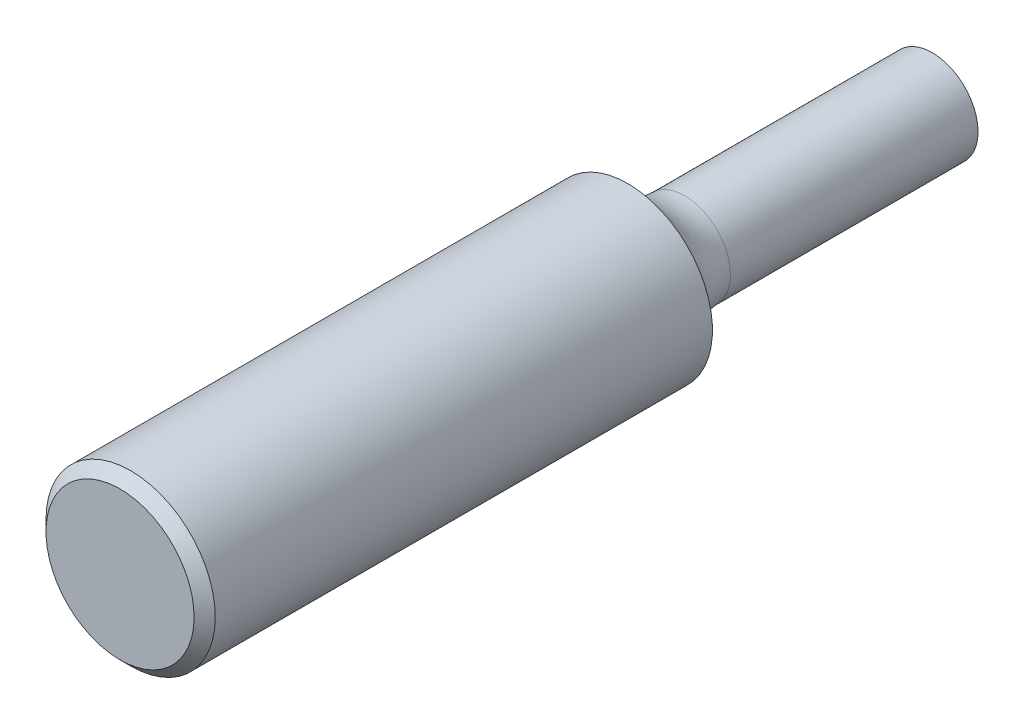
ISO-10303-21;
HEADER;
FILE_DESCRIPTION(('STEP AP214'),'2;1');
FILE_NAME('part.step','',(''),(''),'','','');
FILE_SCHEMA(('AUTOMOTIVE_DESIGN { 1 0 10303 214 1 1 1 1 }'));
ENDSEC;
DATA;
#1=APPLICATION_CONTEXT('core data for automotive mechanical design processes');
#2=APPLICATION_PROTOCOL_DEFINITION('international standard','automotive_design',2000,#1);
#3=PRODUCT_CONTEXT('',#1,'mechanical');
#4=PRODUCT('Part','Part','',(#3));
#5=PRODUCT_RELATED_PRODUCT_CATEGORY('part','',(#4));
#6=PRODUCT_DEFINITION_FORMATION('','',#4);
#7=PRODUCT_DEFINITION_CONTEXT('part definition',#1,'design');
#8=PRODUCT_DEFINITION('design','',#6,#7);
#9=PRODUCT_DEFINITION_SHAPE('','',#8);
#10=(LENGTH_UNIT() NAMED_UNIT(*) SI_UNIT(.MILLI.,.METRE.));
#11=(NAMED_UNIT(*) PLANE_ANGLE_UNIT() SI_UNIT($,.RADIAN.));
#12=(NAMED_UNIT(*) SI_UNIT($,.STERADIAN.) SOLID_ANGLE_UNIT());
#13=UNCERTAINTY_MEASURE_WITH_UNIT(LENGTH_MEASURE(1.E-05),#10,'distance_accuracy_value','');
#14=(GEOMETRIC_REPRESENTATION_CONTEXT(3) GLOBAL_UNCERTAINTY_ASSIGNED_CONTEXT((#13)) GLOBAL_UNIT_ASSIGNED_CONTEXT((#10,
#11,#12)) REPRESENTATION_CONTEXT('',''));
#15=CARTESIAN_POINT('',(0.,0.,0.));
#16=DIRECTION('',(0.,0.,1.));
#17=DIRECTION('',(1.,0.,0.));
#18=AXIS2_PLACEMENT_3D('',#15,#16,#17);
#19=CARTESIAN_POINT('',(0.,0.,-127.));
#20=DIRECTION('',(0.,0.,-1.));
#21=DIRECTION('',(-1.,0.,0.));
#22=AXIS2_PLACEMENT_3D('',#19,#20,#21);
#23=CYLINDRICAL_SURFACE('',#22,1.7145);
#24=CARTESIAN_POINT('',(0.,0.,-5.9417471121125));
#25=DIRECTION('',(0.,0.,-1.));
#26=DIRECTION('',(-1.,0.,0.));
#27=AXIS2_PLACEMENT_3D('',#24,#25,#26);
#28=CIRCLE('',#27,1.7145);
#29=CARTESIAN_POINT('',(-1.7145,0.,-5.9417471121125));
#30=VERTEX_POINT('',#29);
#31=EDGE_CURVE('E48',#30,#30,#28,.T.);
#32=ORIENTED_EDGE('',*,*,#31,.T.);
#33=EDGE_LOOP('',(#32));
#34=FACE_BOUND('',#33,.T.);
#35=CARTESIAN_POINT('',(0.,0.,-15.2347135726124));
#36=DIRECTION('',(0.,0.,-1.));
#37=DIRECTION('',(-1.,0.,0.));
#38=AXIS2_PLACEMENT_3D('',#35,#36,#37);
#39=CIRCLE('',#38,1.7145);
#40=CARTESIAN_POINT('',(-1.7145,0.,-15.2347135726124));
#41=VERTEX_POINT('',#40);
#42=EDGE_CURVE('E55',#41,#41,#39,.F.);
#43=ORIENTED_EDGE('',*,*,#42,.T.);
#44=EDGE_LOOP('',(#43));
#45=FACE_BOUND('',#44,.T.);
#46=ADVANCED_FACE('F36',(#34,#45),#23,.T.);
#47=CARTESIAN_POINT('',(0.,0.,-5.9417471121125));
#48=DIRECTION('',(0.,0.,-1.));
#49=DIRECTION('',(-1.,0.,0.));
#50=AXIS2_PLACEMENT_3D('',#47,#48,#49);
#51=TOROIDAL_SURFACE('',#50,4.0005,2.286);
#52=CARTESIAN_POINT('',(0.,0.,-3.80999999999999));
#53=DIRECTION('',(0.,0.,-1.));
#54=DIRECTION('',(-1.,0.,0.));
#55=AXIS2_PLACEMENT_3D('',#52,#53,#54);
#56=CIRCLE('',#55,3.17499999999999);
#57=CARTESIAN_POINT('',(-3.17499999999999,0.,-3.80999999999999));
#58=VERTEX_POINT('',#57);
#59=EDGE_CURVE('E52',#58,#58,#56,.T.);
#60=ORIENTED_EDGE('',*,*,#59,.T.);
#61=EDGE_LOOP('',(#60));
#62=FACE_BOUND('',#61,.T.);
#63=ORIENTED_EDGE('',*,*,#31,.F.);
#64=EDGE_LOOP('',(#63));
#65=FACE_BOUND('',#64,.T.);
#66=ADVANCED_FACE('F61',(#62,#65),#51,.F.);
#67=CARTESIAN_POINT('',(0.,0.,-127.));
#68=DIRECTION('',(0.,0.,-1.));
#69=DIRECTION('',(-1.,0.,0.));
#70=AXIS2_PLACEMENT_3D('',#67,#68,#69);
#71=CYLINDRICAL_SURFACE('',#70,3.17499999999999);
#72=CARTESIAN_POINT('',(0.,0.,14.843125));
#73=DIRECTION('',(0.,0.,1.));
#74=DIRECTION('',(1.,0.,0.));
#75=AXIS2_PLACEMENT_3D('',#72,#73,#74);
#76=CIRCLE('',#75,3.17499999999999);
#77=CARTESIAN_POINT('',(3.17499999999999,0.,14.843125));
#78=VERTEX_POINT('',#77);
#79=EDGE_CURVE('E44',#78,#78,#76,.F.);
#80=ORIENTED_EDGE('',*,*,#79,.T.);
#81=EDGE_LOOP('',(#80));
#82=FACE_BOUND('',#81,.T.);
#83=ORIENTED_EDGE('',*,*,#59,.F.);
#84=EDGE_LOOP('',(#83));
#85=FACE_BOUND('',#84,.T.);
#86=ADVANCED_FACE('F64',(#82,#85),#71,.T.);
#87=CARTESIAN_POINT('',(0.,0.,15.24));
#88=DIRECTION('',(0.,0.,1.));
#89=DIRECTION('',(1.,0.,0.));
#90=AXIS2_PLACEMENT_3D('',#87,#88,#89);
#91=PLANE('',#90);
#92=CARTESIAN_POINT('',(0.,0.,15.24));
#93=DIRECTION('',(0.,0.,1.));
#94=DIRECTION('',(1.,0.,0.));
#95=AXIS2_PLACEMENT_3D('',#92,#93,#94);
#96=CIRCLE('',#95,2.778125);
#97=CARTESIAN_POINT('',(2.778125,0.,15.24));
#98=VERTEX_POINT('',#97);
#99=EDGE_CURVE('E10',#98,#98,#96,.T.);
#100=ORIENTED_EDGE('',*,*,#99,.T.);
#101=EDGE_LOOP('',(#100));
#102=FACE_BOUND('',#101,.T.);
#103=ADVANCED_FACE('F66',(#102),#91,.T.);
#104=CARTESIAN_POINT('',(0.,0.,-17.907));
#105=DIRECTION('',(0.,0.,-1.));
#106=DIRECTION('',(0.,-1.,0.));
#107=AXIS2_PLACEMENT_3D('',#104,#105,#106);
#108=SPHERICAL_SURFACE('',#107,3.175);
#109=ORIENTED_EDGE('',*,*,#42,.F.);
#110=EDGE_LOOP('',(#109));
#111=FACE_BOUND('',#110,.T.);
#112=ADVANCED_FACE('F72',(#111),#108,.F.);
#113=CARTESIAN_POINT('',(0.,0.,14.843125));
#114=DIRECTION('',(0.,0.,-1.));
#115=DIRECTION('',(-1.,0.,0.));
#116=AXIS2_PLACEMENT_3D('',#113,#114,#115);
#117=CONICAL_SURFACE('',#116,3.17499999999999,0.785398163397453);
#118=ORIENTED_EDGE('',*,*,#99,.F.);
#119=EDGE_LOOP('',(#118));
#120=FACE_BOUND('',#119,.T.);
#121=ORIENTED_EDGE('',*,*,#79,.F.);
#122=EDGE_LOOP('',(#121));
#123=FACE_BOUND('',#122,.T.);
#124=ADVANCED_FACE('F39',(#120,#123),#117,.T.);
#125=CLOSED_SHELL('',(#46,#66,#86,#103,#112,#124));
#126=MANIFOLD_SOLID_BREP('B2',#125);
#127=ADVANCED_BREP_SHAPE_REPRESENTATION('',(#18,#126),#14);
#128=SHAPE_DEFINITION_REPRESENTATION(#9,#127);
ENDSEC;
END-ISO-10303-21;
